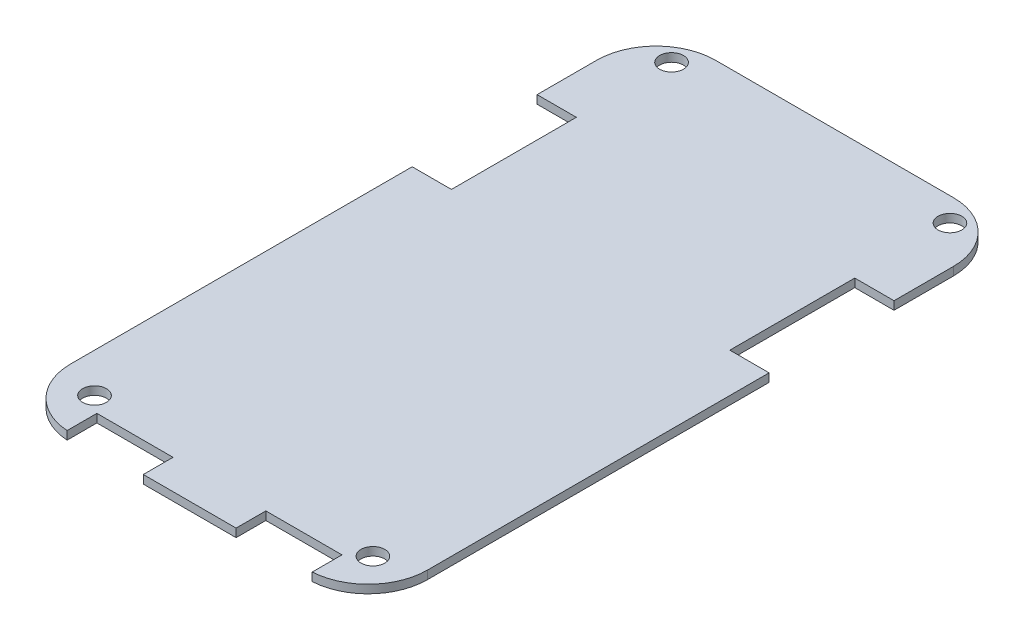
ISO-10303-21;
HEADER;
FILE_DESCRIPTION(('STEP AP214'),'2;1');
FILE_NAME('part.step','',(''),(''),'','','');
FILE_SCHEMA(('AUTOMOTIVE_DESIGN { 1 0 10303 214 1 1 1 1 }'));
ENDSEC;
DATA;
#1=APPLICATION_CONTEXT('core data for automotive mechanical design processes');
#2=APPLICATION_PROTOCOL_DEFINITION('international standard','automotive_design',2000,#1);
#3=PRODUCT_CONTEXT('',#1,'mechanical');
#4=PRODUCT('Part','Part','',(#3));
#5=PRODUCT_RELATED_PRODUCT_CATEGORY('part','',(#4));
#6=PRODUCT_DEFINITION_FORMATION('','',#4);
#7=PRODUCT_DEFINITION_CONTEXT('part definition',#1,'design');
#8=PRODUCT_DEFINITION('design','',#6,#7);
#9=PRODUCT_DEFINITION_SHAPE('','',#8);
#10=(LENGTH_UNIT() NAMED_UNIT(*) SI_UNIT(.MILLI.,.METRE.));
#11=(NAMED_UNIT(*) PLANE_ANGLE_UNIT() SI_UNIT($,.RADIAN.));
#12=(NAMED_UNIT(*) SI_UNIT($,.STERADIAN.) SOLID_ANGLE_UNIT());
#13=UNCERTAINTY_MEASURE_WITH_UNIT(LENGTH_MEASURE(1.E-05),#10,'distance_accuracy_value','');
#14=(GEOMETRIC_REPRESENTATION_CONTEXT(3) GLOBAL_UNCERTAINTY_ASSIGNED_CONTEXT((#13)) GLOBAL_UNIT_ASSIGNED_CONTEXT((#10,
#11,#12)) REPRESENTATION_CONTEXT('',''));
#15=CARTESIAN_POINT('',(0.,0.,0.));
#16=DIRECTION('',(0.,0.,1.));
#17=DIRECTION('',(1.,0.,0.));
#18=AXIS2_PLACEMENT_3D('',#15,#16,#17);
#19=CARTESIAN_POINT('',(-15.,0.7,27.1));
#20=DIRECTION('',(0.,0.,-1.));
#21=DIRECTION('',(-1.,0.,0.));
#22=AXIS2_PLACEMENT_3D('',#19,#20,#21);
#23=PLANE('',#22);
#24=DIRECTION('',(0.,1.,0.));
#25=VECTOR('',#24,1.);
#26=CARTESIAN_POINT('',(3.9,0.,27.1));
#27=LINE('',#26,#25);
#28=CARTESIAN_POINT('',(3.9,0.,27.1));
#29=VERTEX_POINT('',#28);
#30=CARTESIAN_POINT('',(3.9,0.7,27.1));
#31=VERTEX_POINT('',#30);
#32=EDGE_CURVE('E353',#29,#31,#27,.T.);
#33=ORIENTED_EDGE('',*,*,#32,.T.);
#34=DIRECTION('',(1.,0.,0.));
#35=VECTOR('',#34,1.);
#36=CARTESIAN_POINT('',(-15.,0.7,27.1));
#37=LINE('',#36,#35);
#38=CARTESIAN_POINT('',(-3.9,0.7,27.1));
#39=VERTEX_POINT('',#38);
#40=EDGE_CURVE('E255',#39,#31,#37,.T.);
#41=ORIENTED_EDGE('',*,*,#40,.F.);
#42=DIRECTION('',(0.,1.,0.));
#43=VECTOR('',#42,1.);
#44=CARTESIAN_POINT('',(-3.9,0.,27.1));
#45=LINE('',#44,#43);
#46=CARTESIAN_POINT('',(-3.9,0.,27.1));
#47=VERTEX_POINT('',#46);
#48=EDGE_CURVE('E301',#47,#39,#45,.T.);
#49=ORIENTED_EDGE('',*,*,#48,.F.);
#50=DIRECTION('',(1.,0.,0.));
#51=VECTOR('',#50,1.);
#52=CARTESIAN_POINT('',(-15.,0.,27.1));
#53=LINE('',#52,#51);
#54=EDGE_CURVE('E215',#47,#29,#53,.T.);
#55=ORIENTED_EDGE('',*,*,#54,.T.);
#56=EDGE_LOOP('',(#33,#41,#49,#55));
#57=FACE_BOUND('',#56,.T.);
#58=ADVANCED_FACE('F36',(#57),#23,.F.);
#59=CARTESIAN_POINT('',(15.,0.7,-27.1));
#60=DIRECTION('',(-1.,0.,0.));
#61=DIRECTION('',(0.,0.,1.));
#62=AXIS2_PLACEMENT_3D('',#59,#60,#61);
#63=PLANE('',#62);
#64=DIRECTION('',(0.,0.,-1.));
#65=VECTOR('',#64,1.);
#66=CARTESIAN_POINT('',(15.,0.7,-27.1));
#67=LINE('',#66,#65);
#68=CARTESIAN_POINT('',(15.,0.7,22.1090081146129));
#69=VERTEX_POINT('',#68);
#70=CARTESIAN_POINT('',(15.,0.7,-6.6));
#71=VERTEX_POINT('',#70);
#72=EDGE_CURVE('E254',#69,#71,#67,.T.);
#73=ORIENTED_EDGE('',*,*,#72,.F.);
#74=DIRECTION('',(0.,1.,0.));
#75=VECTOR('',#74,1.);
#76=CARTESIAN_POINT('',(15.,0.7,22.1090081146129));
#77=LINE('',#76,#75);
#78=CARTESIAN_POINT('',(15.,0.,22.1090081146129));
#79=VERTEX_POINT('',#78);
#80=EDGE_CURVE('E242',#69,#79,#77,.F.);
#81=ORIENTED_EDGE('',*,*,#80,.T.);
#82=DIRECTION('',(0.,0.,-1.));
#83=VECTOR('',#82,1.);
#84=CARTESIAN_POINT('',(15.,0.,-27.1));
#85=LINE('',#84,#83);
#86=CARTESIAN_POINT('',(15.,0.,-6.6));
#87=VERTEX_POINT('',#86);
#88=EDGE_CURVE('E214',#79,#87,#85,.T.);
#89=ORIENTED_EDGE('',*,*,#88,.T.);
#90=DIRECTION('',(0.,1.,0.));
#91=VECTOR('',#90,1.);
#92=CARTESIAN_POINT('',(15.,0.,-6.6));
#93=LINE('',#92,#91);
#94=EDGE_CURVE('E307',#87,#71,#93,.T.);
#95=ORIENTED_EDGE('',*,*,#94,.T.);
#96=EDGE_LOOP('',(#73,#81,#89,#95));
#97=FACE_BOUND('',#96,.T.);
#98=ADVANCED_FACE('F436',(#97),#63,.F.);
#99=CARTESIAN_POINT('',(15.,0.,-17.1));
#100=VERTEX_POINT('',#99);
#101=CARTESIAN_POINT('',(15.,0.,-22.1));
#102=VERTEX_POINT('',#101);
#103=EDGE_CURVE('E204',#100,#102,#85,.T.);
#104=ORIENTED_EDGE('',*,*,#103,.T.);
#105=DIRECTION('',(0.,-1.,0.));
#106=VECTOR('',#105,1.);
#107=CARTESIAN_POINT('',(15.,0.7,-22.1));
#108=LINE('',#107,#106);
#109=CARTESIAN_POINT('',(15.,0.7,-22.1));
#110=VERTEX_POINT('',#109);
#111=EDGE_CURVE('E44',#102,#110,#108,.F.);
#112=ORIENTED_EDGE('',*,*,#111,.T.);
#113=CARTESIAN_POINT('',(15.,0.7,-17.1));
#114=VERTEX_POINT('',#113);
#115=EDGE_CURVE('E207',#114,#110,#67,.T.);
#116=ORIENTED_EDGE('',*,*,#115,.F.);
#117=DIRECTION('',(0.,1.,0.));
#118=VECTOR('',#117,1.);
#119=CARTESIAN_POINT('',(15.,0.,-17.1));
#120=LINE('',#119,#118);
#121=EDGE_CURVE('E190',#100,#114,#120,.T.);
#122=ORIENTED_EDGE('',*,*,#121,.F.);
#123=EDGE_LOOP('',(#104,#112,#116,#122));
#124=FACE_BOUND('',#123,.T.);
#125=ADVANCED_FACE('F203',(#124),#63,.F.);
#126=CARTESIAN_POINT('',(0.,0.7,0.));
#127=DIRECTION('',(0.,1.,0.));
#128=DIRECTION('',(0.,0.,1.));
#129=AXIS2_PLACEMENT_3D('',#126,#127,#128);
#130=PLANE('',#129);
#131=CARTESIAN_POINT('',(11.7,0.7,-25.1));
#132=DIRECTION('',(0.,-1.,0.));
#133=DIRECTION('',(0.,0.,1.));
#134=AXIS2_PLACEMENT_3D('',#131,#132,#133);
#135=CIRCLE('',#134,1.);
#136=CARTESIAN_POINT('',(11.7,0.7,-24.1));
#137=VERTEX_POINT('',#136);
#138=EDGE_CURVE('E405',#137,#137,#135,.T.);
#139=ORIENTED_EDGE('',*,*,#138,.T.);
#140=EDGE_LOOP('',(#139));
#141=FACE_BOUND('',#140,.T.);
#142=CARTESIAN_POINT('',(11.7,0.7,23.4));
#143=DIRECTION('',(0.,-1.,0.));
#144=DIRECTION('',(0.,0.,1.));
#145=AXIS2_PLACEMENT_3D('',#142,#143,#144);
#146=CIRCLE('',#145,1.);
#147=CARTESIAN_POINT('',(11.7,0.7,24.4));
#148=VERTEX_POINT('',#147);
#149=EDGE_CURVE('E399',#148,#148,#146,.T.);
#150=ORIENTED_EDGE('',*,*,#149,.T.);
#151=EDGE_LOOP('',(#150));
#152=FACE_BOUND('',#151,.T.);
#153=CARTESIAN_POINT('',(-11.7,0.7,-25.1));
#154=DIRECTION('',(0.,1.,0.));
#155=DIRECTION('',(0.,0.,1.));
#156=AXIS2_PLACEMENT_3D('',#153,#154,#155);
#157=CIRCLE('',#156,1.);
#158=CARTESIAN_POINT('',(-11.7,0.7,-24.1));
#159=VERTEX_POINT('',#158);
#160=EDGE_CURVE('E394',#159,#159,#157,.T.);
#161=ORIENTED_EDGE('',*,*,#160,.F.);
#162=EDGE_LOOP('',(#161));
#163=FACE_BOUND('',#162,.T.);
#164=CARTESIAN_POINT('',(-11.7,0.7,23.4));
#165=DIRECTION('',(0.,1.,0.));
#166=DIRECTION('',(0.,0.,1.));
#167=AXIS2_PLACEMENT_3D('',#164,#165,#166);
#168=CIRCLE('',#167,1.);
#169=CARTESIAN_POINT('',(-11.7,0.7,24.4));
#170=VERTEX_POINT('',#169);
#171=EDGE_CURVE('E390',#170,#170,#168,.T.);
#172=ORIENTED_EDGE('',*,*,#171,.F.);
#173=EDGE_LOOP('',(#172));
#174=FACE_BOUND('',#173,.T.);
#175=DIRECTION('',(0.,0.,1.));
#176=VECTOR('',#175,1.);
#177=CARTESIAN_POINT('',(-15.,0.7,-27.1));
#178=LINE('',#177,#176);
#179=CARTESIAN_POINT('',(-15.,0.7,-6.6));
#180=VERTEX_POINT('',#179);
#181=CARTESIAN_POINT('',(-15.,0.7,22.1090081146129));
#182=VERTEX_POINT('',#181);
#183=EDGE_CURVE('E224',#180,#182,#178,.T.);
#184=ORIENTED_EDGE('',*,*,#183,.T.);
#185=CARTESIAN_POINT('',(-9.99999999999999,0.7,22.1090081146129));
#186=DIRECTION('',(0.,1.,0.));
#187=DIRECTION('',(0.,0.,1.));
#188=AXIS2_PLACEMENT_3D('',#185,#186,#187);
#189=CIRCLE('',#188,5.);
#190=CARTESIAN_POINT('',(-10.3,0.7,27.1));
#191=VERTEX_POINT('',#190);
#192=EDGE_CURVE('E240',#182,#191,#189,.T.);
#193=ORIENTED_EDGE('',*,*,#192,.T.);
#194=DIRECTION('',(0.,0.,1.));
#195=VECTOR('',#194,1.);
#196=CARTESIAN_POINT('',(-10.3,0.7,24.6));
#197=LINE('',#196,#195);
#198=CARTESIAN_POINT('',(-10.3,0.7,24.6));
#199=VERTEX_POINT('',#198);
#200=EDGE_CURVE('E314',#199,#191,#197,.T.);
#201=ORIENTED_EDGE('',*,*,#200,.F.);
#202=DIRECTION('',(-1.,0.,0.));
#203=VECTOR('',#202,1.);
#204=CARTESIAN_POINT('',(-10.3,0.7,24.6));
#205=LINE('',#204,#203);
#206=CARTESIAN_POINT('',(-3.9,0.7,24.6));
#207=VERTEX_POINT('',#206);
#208=EDGE_CURVE('E308',#207,#199,#205,.T.);
#209=ORIENTED_EDGE('',*,*,#208,.F.);
#210=DIRECTION('',(0.,0.,-1.));
#211=VECTOR('',#210,1.);
#212=CARTESIAN_POINT('',(-3.9,0.7,24.6));
#213=LINE('',#212,#211);
#214=EDGE_CURVE('E311',#39,#207,#213,.T.);
#215=ORIENTED_EDGE('',*,*,#214,.F.);
#216=ORIENTED_EDGE('',*,*,#40,.T.);
#217=DIRECTION('',(0.,0.,-1.));
#218=VECTOR('',#217,1.);
#219=CARTESIAN_POINT('',(3.9,0.7,24.6));
#220=LINE('',#219,#218);
#221=CARTESIAN_POINT('',(3.9,0.7,24.6));
#222=VERTEX_POINT('',#221);
#223=EDGE_CURVE('E358',#31,#222,#220,.T.);
#224=ORIENTED_EDGE('',*,*,#223,.T.);
#225=DIRECTION('',(1.,0.,0.));
#226=VECTOR('',#225,1.);
#227=CARTESIAN_POINT('',(10.3,0.7,24.6));
#228=LINE('',#227,#226);
#229=CARTESIAN_POINT('',(10.3,0.7,24.6));
#230=VERTEX_POINT('',#229);
#231=EDGE_CURVE('E362',#222,#230,#228,.T.);
#232=ORIENTED_EDGE('',*,*,#231,.T.);
#233=DIRECTION('',(0.,0.,1.));
#234=VECTOR('',#233,1.);
#235=CARTESIAN_POINT('',(10.3,0.7,24.6));
#236=LINE('',#235,#234);
#237=CARTESIAN_POINT('',(10.3,0.7,27.1));
#238=VERTEX_POINT('',#237);
#239=EDGE_CURVE('E365',#230,#238,#236,.T.);
#240=ORIENTED_EDGE('',*,*,#239,.T.);
#241=CARTESIAN_POINT('',(10.,0.7,22.1090081146129));
#242=DIRECTION('',(0.,1.,0.));
#243=DIRECTION('',(0.,0.,1.));
#244=AXIS2_PLACEMENT_3D('',#241,#242,#243);
#245=CIRCLE('',#244,5.);
#246=EDGE_CURVE('E238',#238,#69,#245,.T.);
#247=ORIENTED_EDGE('',*,*,#246,.T.);
#248=ORIENTED_EDGE('',*,*,#72,.T.);
#249=DIRECTION('',(-1.,0.,0.));
#250=VECTOR('',#249,1.);
#251=CARTESIAN_POINT('',(15.,0.7,-6.6));
#252=LINE('',#251,#250);
#253=CARTESIAN_POINT('',(11.7,0.7,-6.6));
#254=VERTEX_POINT('',#253);
#255=EDGE_CURVE('E198',#71,#254,#252,.T.);
#256=ORIENTED_EDGE('',*,*,#255,.T.);
#257=DIRECTION('',(0.,0.,-1.));
#258=VECTOR('',#257,1.);
#259=CARTESIAN_POINT('',(11.7,0.7,-17.1));
#260=LINE('',#259,#258);
#261=CARTESIAN_POINT('',(11.7,0.7,-17.1));
#262=VERTEX_POINT('',#261);
#263=EDGE_CURVE('E382',#254,#262,#260,.T.);
#264=ORIENTED_EDGE('',*,*,#263,.T.);
#265=DIRECTION('',(1.,0.,0.));
#266=VECTOR('',#265,1.);
#267=CARTESIAN_POINT('',(15.,0.7,-17.1));
#268=LINE('',#267,#266);
#269=EDGE_CURVE('E253',#262,#114,#268,.T.);
#270=ORIENTED_EDGE('',*,*,#269,.T.);
#271=ORIENTED_EDGE('',*,*,#115,.T.);
#272=CARTESIAN_POINT('',(9.99999999999999,0.7,-22.1));
#273=DIRECTION('',(0.,1.,0.));
#274=DIRECTION('',(0.,0.,1.));
#275=AXIS2_PLACEMENT_3D('',#272,#273,#274);
#276=CIRCLE('',#275,5.);
#277=CARTESIAN_POINT('',(9.99999999999999,0.7,-27.1));
#278=VERTEX_POINT('',#277);
#279=EDGE_CURVE('E236',#110,#278,#276,.T.);
#280=ORIENTED_EDGE('',*,*,#279,.T.);
#281=DIRECTION('',(-1.,0.,0.));
#282=VECTOR('',#281,1.);
#283=CARTESIAN_POINT('',(-15.,0.7,-27.1));
#284=LINE('',#283,#282);
#285=CARTESIAN_POINT('',(-10.,0.7,-27.1));
#286=VERTEX_POINT('',#285);
#287=EDGE_CURVE('E227',#278,#286,#284,.T.);
#288=ORIENTED_EDGE('',*,*,#287,.T.);
#289=CARTESIAN_POINT('',(-10.,0.7,-22.1));
#290=DIRECTION('',(0.,1.,0.));
#291=DIRECTION('',(0.,0.,1.));
#292=AXIS2_PLACEMENT_3D('',#289,#290,#291);
#293=CIRCLE('',#292,5.);
#294=CARTESIAN_POINT('',(-15.,0.7,-22.1));
#295=VERTEX_POINT('',#294);
#296=EDGE_CURVE('E51',#286,#295,#293,.T.);
#297=ORIENTED_EDGE('',*,*,#296,.T.);
#298=CARTESIAN_POINT('',(-15.,0.7,-17.1));
#299=VERTEX_POINT('',#298);
#300=EDGE_CURVE('E268',#295,#299,#178,.T.);
#301=ORIENTED_EDGE('',*,*,#300,.T.);
#302=DIRECTION('',(-1.,0.,0.));
#303=VECTOR('',#302,1.);
#304=CARTESIAN_POINT('',(-15.,0.7,-17.1));
#305=LINE('',#304,#303);
#306=CARTESIAN_POINT('',(-11.7,0.7,-17.1));
#307=VERTEX_POINT('',#306);
#308=EDGE_CURVE('E290',#307,#299,#305,.T.);
#309=ORIENTED_EDGE('',*,*,#308,.F.);
#310=DIRECTION('',(0.,0.,-1.));
#311=VECTOR('',#310,1.);
#312=CARTESIAN_POINT('',(-11.7,0.7,-17.1));
#313=LINE('',#312,#311);
#314=CARTESIAN_POINT('',(-11.7,0.7,-6.6));
#315=VERTEX_POINT('',#314);
#316=EDGE_CURVE('E336',#315,#307,#313,.T.);
#317=ORIENTED_EDGE('',*,*,#316,.F.);
#318=DIRECTION('',(1.,0.,0.));
#319=VECTOR('',#318,1.);
#320=CARTESIAN_POINT('',(-15.,0.7,-6.6));
#321=LINE('',#320,#319);
#322=EDGE_CURVE('E317',#180,#315,#321,.T.);
#323=ORIENTED_EDGE('',*,*,#322,.F.);
#324=EDGE_LOOP('',(#184,#193,#201,#209,#215,#216,#224,#232,#240,#247,#248,#256,#264,#270,#271,
#280,#288,#297,#301,#309,#317,#323));
#325=FACE_BOUND('',#324,.T.);
#326=ADVANCED_FACE('F251',(#141,#152,#163,#174,#325),#130,.T.);
#327=CARTESIAN_POINT('',(0.,0.,0.));
#328=DIRECTION('',(0.,1.,0.));
#329=DIRECTION('',(0.,0.,1.));
#330=AXIS2_PLACEMENT_3D('',#327,#328,#329);
#331=PLANE('',#330);
#332=CARTESIAN_POINT('',(11.7,0.,-25.1));
#333=DIRECTION('',(0.,-1.,0.));
#334=DIRECTION('',(0.,0.,1.));
#335=AXIS2_PLACEMENT_3D('',#332,#333,#334);
#336=CIRCLE('',#335,1.);
#337=CARTESIAN_POINT('',(11.7,0.,-24.1));
#338=VERTEX_POINT('',#337);
#339=EDGE_CURVE('E391',#338,#338,#336,.T.);
#340=ORIENTED_EDGE('',*,*,#339,.F.);
#341=EDGE_LOOP('',(#340));
#342=FACE_BOUND('',#341,.T.);
#343=CARTESIAN_POINT('',(11.7,0.,23.4));
#344=DIRECTION('',(0.,-1.,0.));
#345=DIRECTION('',(0.,0.,1.));
#346=AXIS2_PLACEMENT_3D('',#343,#344,#345);
#347=CIRCLE('',#346,1.);
#348=CARTESIAN_POINT('',(11.7,0.,24.4));
#349=VERTEX_POINT('',#348);
#350=EDGE_CURVE('E402',#349,#349,#347,.T.);
#351=ORIENTED_EDGE('',*,*,#350,.F.);
#352=EDGE_LOOP('',(#351));
#353=FACE_BOUND('',#352,.T.);
#354=CARTESIAN_POINT('',(-11.7,0.,-25.1));
#355=DIRECTION('',(0.,1.,0.));
#356=DIRECTION('',(0.,0.,1.));
#357=AXIS2_PLACEMENT_3D('',#354,#355,#356);
#358=CIRCLE('',#357,1.);
#359=CARTESIAN_POINT('',(-11.7,0.,-24.1));
#360=VERTEX_POINT('',#359);
#361=EDGE_CURVE('E368',#360,#360,#358,.T.);
#362=ORIENTED_EDGE('',*,*,#361,.T.);
#363=EDGE_LOOP('',(#362));
#364=FACE_BOUND('',#363,.T.);
#365=CARTESIAN_POINT('',(-11.7,0.,23.4));
#366=DIRECTION('',(0.,1.,0.));
#367=DIRECTION('',(0.,0.,1.));
#368=AXIS2_PLACEMENT_3D('',#365,#366,#367);
#369=CIRCLE('',#368,1.);
#370=CARTESIAN_POINT('',(-11.7,0.,24.4));
#371=VERTEX_POINT('',#370);
#372=EDGE_CURVE('E387',#371,#371,#369,.T.);
#373=ORIENTED_EDGE('',*,*,#372,.T.);
#374=EDGE_LOOP('',(#373));
#375=FACE_BOUND('',#374,.T.);
#376=DIRECTION('',(0.,0.,1.));
#377=VECTOR('',#376,1.);
#378=CARTESIAN_POINT('',(-10.3,0.,24.6));
#379=LINE('',#378,#377);
#380=CARTESIAN_POINT('',(-10.3,0.,24.6));
#381=VERTEX_POINT('',#380);
#382=CARTESIAN_POINT('',(-10.3,0.,27.1));
#383=VERTEX_POINT('',#382);
#384=EDGE_CURVE('E276',#381,#383,#379,.T.);
#385=ORIENTED_EDGE('',*,*,#384,.T.);
#386=CARTESIAN_POINT('',(-9.99999999999999,0.,22.1090081146129));
#387=DIRECTION('',(0.,1.,0.));
#388=DIRECTION('',(0.,0.,1.));
#389=AXIS2_PLACEMENT_3D('',#386,#387,#388);
#390=CIRCLE('',#389,5.);
#391=CARTESIAN_POINT('',(-15.,0.,22.1090081146129));
#392=VERTEX_POINT('',#391);
#393=EDGE_CURVE('E231',#383,#392,#390,.F.);
#394=ORIENTED_EDGE('',*,*,#393,.T.);
#395=DIRECTION('',(0.,0.,1.));
#396=VECTOR('',#395,1.);
#397=CARTESIAN_POINT('',(-15.,0.,-27.1));
#398=LINE('',#397,#396);
#399=CARTESIAN_POINT('',(-15.,0.,-6.6));
#400=VERTEX_POINT('',#399);
#401=EDGE_CURVE('E279',#400,#392,#398,.T.);
#402=ORIENTED_EDGE('',*,*,#401,.F.);
#403=DIRECTION('',(1.,0.,0.));
#404=VECTOR('',#403,1.);
#405=CARTESIAN_POINT('',(-15.,0.,-6.6));
#406=LINE('',#405,#404);
#407=CARTESIAN_POINT('',(-11.7,0.,-6.6));
#408=VERTEX_POINT('',#407);
#409=EDGE_CURVE('E345',#400,#408,#406,.T.);
#410=ORIENTED_EDGE('',*,*,#409,.T.);
#411=DIRECTION('',(0.,0.,-1.));
#412=VECTOR('',#411,1.);
#413=CARTESIAN_POINT('',(-11.7,0.,-17.1));
#414=LINE('',#413,#412);
#415=CARTESIAN_POINT('',(-11.7,0.,-17.1));
#416=VERTEX_POINT('',#415);
#417=EDGE_CURVE('E342',#408,#416,#414,.T.);
#418=ORIENTED_EDGE('',*,*,#417,.T.);
#419=DIRECTION('',(-1.,0.,0.));
#420=VECTOR('',#419,1.);
#421=CARTESIAN_POINT('',(-15.,0.,-17.1));
#422=LINE('',#421,#420);
#423=CARTESIAN_POINT('',(-15.,0.,-17.1));
#424=VERTEX_POINT('',#423);
#425=EDGE_CURVE('E296',#416,#424,#422,.T.);
#426=ORIENTED_EDGE('',*,*,#425,.T.);
#427=CARTESIAN_POINT('',(-15.,0.,-22.1));
#428=VERTEX_POINT('',#427);
#429=EDGE_CURVE('E219',#428,#424,#398,.T.);
#430=ORIENTED_EDGE('',*,*,#429,.F.);
#431=CARTESIAN_POINT('',(-10.,0.,-22.1));
#432=DIRECTION('',(0.,1.,0.));
#433=DIRECTION('',(0.,0.,1.));
#434=AXIS2_PLACEMENT_3D('',#431,#432,#433);
#435=CIRCLE('',#434,5.);
#436=CARTESIAN_POINT('',(-10.,0.,-27.1));
#437=VERTEX_POINT('',#436);
#438=EDGE_CURVE('E225',#428,#437,#435,.F.);
#439=ORIENTED_EDGE('',*,*,#438,.T.);
#440=DIRECTION('',(-1.,0.,0.));
#441=VECTOR('',#440,1.);
#442=CARTESIAN_POINT('',(-15.,0.,-27.1));
#443=LINE('',#442,#441);
#444=CARTESIAN_POINT('',(9.99999999999999,0.,-27.1));
#445=VERTEX_POINT('',#444);
#446=EDGE_CURVE('E217',#445,#437,#443,.T.);
#447=ORIENTED_EDGE('',*,*,#446,.F.);
#448=CARTESIAN_POINT('',(9.99999999999999,0.,-22.1));
#449=DIRECTION('',(0.,1.,0.));
#450=DIRECTION('',(0.,0.,1.));
#451=AXIS2_PLACEMENT_3D('',#448,#449,#450);
#452=CIRCLE('',#451,5.);
#453=EDGE_CURVE('E213',#445,#102,#452,.F.);
#454=ORIENTED_EDGE('',*,*,#453,.T.);
#455=ORIENTED_EDGE('',*,*,#103,.F.);
#456=DIRECTION('',(1.,0.,0.));
#457=VECTOR('',#456,1.);
#458=CARTESIAN_POINT('',(15.,0.,-17.1));
#459=LINE('',#458,#457);
#460=CARTESIAN_POINT('',(11.7,0.,-17.1));
#461=VERTEX_POINT('',#460);
#462=EDGE_CURVE('E186',#461,#100,#459,.T.);
#463=ORIENTED_EDGE('',*,*,#462,.F.);
#464=DIRECTION('',(0.,0.,-1.));
#465=VECTOR('',#464,1.);
#466=CARTESIAN_POINT('',(11.7,0.,-17.1));
#467=LINE('',#466,#465);
#468=CARTESIAN_POINT('',(11.7,0.,-6.6));
#469=VERTEX_POINT('',#468);
#470=EDGE_CURVE('E197',#469,#461,#467,.T.);
#471=ORIENTED_EDGE('',*,*,#470,.F.);
#472=DIRECTION('',(-1.,0.,0.));
#473=VECTOR('',#472,1.);
#474=CARTESIAN_POINT('',(15.,0.,-6.6));
#475=LINE('',#474,#473);
#476=EDGE_CURVE('E208',#87,#469,#475,.T.);
#477=ORIENTED_EDGE('',*,*,#476,.F.);
#478=ORIENTED_EDGE('',*,*,#88,.F.);
#479=CARTESIAN_POINT('',(10.,0.,22.1090081146129));
#480=DIRECTION('',(0.,1.,0.));
#481=DIRECTION('',(0.,0.,1.));
#482=AXIS2_PLACEMENT_3D('',#479,#480,#481);
#483=CIRCLE('',#482,5.);
#484=CARTESIAN_POINT('',(10.3,0.,27.1));
#485=VERTEX_POINT('',#484);
#486=EDGE_CURVE('E229',#79,#485,#483,.F.);
#487=ORIENTED_EDGE('',*,*,#486,.T.);
#488=DIRECTION('',(0.,0.,1.));
#489=VECTOR('',#488,1.);
#490=CARTESIAN_POINT('',(10.3,0.,24.6));
#491=LINE('',#490,#489);
#492=CARTESIAN_POINT('',(10.3,0.,24.6));
#493=VERTEX_POINT('',#492);
#494=EDGE_CURVE('E361',#493,#485,#491,.T.);
#495=ORIENTED_EDGE('',*,*,#494,.F.);
#496=DIRECTION('',(1.,0.,0.));
#497=VECTOR('',#496,1.);
#498=CARTESIAN_POINT('',(10.3,0.,24.6));
#499=LINE('',#498,#497);
#500=CARTESIAN_POINT('',(3.9,0.,24.6));
#501=VERTEX_POINT('',#500);
#502=EDGE_CURVE('E371',#501,#493,#499,.T.);
#503=ORIENTED_EDGE('',*,*,#502,.F.);
#504=DIRECTION('',(0.,0.,-1.));
#505=VECTOR('',#504,1.);
#506=CARTESIAN_POINT('',(3.9,0.,24.6));
#507=LINE('',#506,#505);
#508=EDGE_CURVE('E351',#29,#501,#507,.T.);
#509=ORIENTED_EDGE('',*,*,#508,.F.);
#510=ORIENTED_EDGE('',*,*,#54,.F.);
#511=DIRECTION('',(0.,0.,-1.));
#512=VECTOR('',#511,1.);
#513=CARTESIAN_POINT('',(-3.9,0.,24.6));
#514=LINE('',#513,#512);
#515=CARTESIAN_POINT('',(-3.9,0.,24.6));
#516=VERTEX_POINT('',#515);
#517=EDGE_CURVE('E319',#47,#516,#514,.T.);
#518=ORIENTED_EDGE('',*,*,#517,.T.);
#519=DIRECTION('',(-1.,0.,0.));
#520=VECTOR('',#519,1.);
#521=CARTESIAN_POINT('',(-10.3,0.,24.6));
#522=LINE('',#521,#520);
#523=EDGE_CURVE('E300',#516,#381,#522,.T.);
#524=ORIENTED_EDGE('',*,*,#523,.T.);
#525=EDGE_LOOP('',(#385,#394,#402,#410,#418,#426,#430,#439,#447,#454,#455,#463,#471,#477,#478,
#487,#495,#503,#509,#510,#518,#524));
#526=FACE_BOUND('',#525,.T.);
#527=ADVANCED_FACE('F211',(#342,#353,#364,#375,#526),#331,.F.);
#528=CARTESIAN_POINT('',(-15.,0.7,-27.1));
#529=DIRECTION('',(1.,0.,0.));
#530=DIRECTION('',(0.,0.,-1.));
#531=AXIS2_PLACEMENT_3D('',#528,#529,#530);
#532=PLANE('',#531);
#533=ORIENTED_EDGE('',*,*,#300,.F.);
#534=DIRECTION('',(0.,-1.,0.));
#535=VECTOR('',#534,1.);
#536=CARTESIAN_POINT('',(-15.,0.7,-22.1));
#537=LINE('',#536,#535);
#538=EDGE_CURVE('E11',#295,#428,#537,.T.);
#539=ORIENTED_EDGE('',*,*,#538,.T.);
#540=ORIENTED_EDGE('',*,*,#429,.T.);
#541=DIRECTION('',(0.,1.,0.));
#542=VECTOR('',#541,1.);
#543=CARTESIAN_POINT('',(-15.,0.,-17.1));
#544=LINE('',#543,#542);
#545=EDGE_CURVE('E269',#424,#299,#544,.T.);
#546=ORIENTED_EDGE('',*,*,#545,.T.);
#547=EDGE_LOOP('',(#533,#539,#540,#546));
#548=FACE_BOUND('',#547,.T.);
#549=ADVANCED_FACE('F265',(#548),#532,.F.);
#550=ORIENTED_EDGE('',*,*,#401,.T.);
#551=DIRECTION('',(0.,1.,0.));
#552=VECTOR('',#551,1.);
#553=CARTESIAN_POINT('',(-15.,0.7,22.1090081146129));
#554=LINE('',#553,#552);
#555=EDGE_CURVE('E233',#392,#182,#554,.T.);
#556=ORIENTED_EDGE('',*,*,#555,.T.);
#557=ORIENTED_EDGE('',*,*,#183,.F.);
#558=DIRECTION('',(0.,1.,0.));
#559=VECTOR('',#558,1.);
#560=CARTESIAN_POINT('',(-15.,0.,-6.6));
#561=LINE('',#560,#559);
#562=EDGE_CURVE('E294',#400,#180,#561,.T.);
#563=ORIENTED_EDGE('',*,*,#562,.F.);
#564=EDGE_LOOP('',(#550,#556,#557,#563));
#565=FACE_BOUND('',#564,.T.);
#566=ADVANCED_FACE('F331',(#565),#532,.F.);
#567=CARTESIAN_POINT('',(-15.,0.7,-27.1));
#568=DIRECTION('',(0.,0.,1.));
#569=DIRECTION('',(1.,0.,0.));
#570=AXIS2_PLACEMENT_3D('',#567,#568,#569);
#571=PLANE('',#570);
#572=ORIENTED_EDGE('',*,*,#287,.F.);
#573=DIRECTION('',(0.,-1.,0.));
#574=VECTOR('',#573,1.);
#575=CARTESIAN_POINT('',(9.99999999999999,0.7,-27.1));
#576=LINE('',#575,#574);
#577=EDGE_CURVE('E246',#278,#445,#576,.T.);
#578=ORIENTED_EDGE('',*,*,#577,.T.);
#579=ORIENTED_EDGE('',*,*,#446,.T.);
#580=DIRECTION('',(0.,-1.,0.));
#581=VECTOR('',#580,1.);
#582=CARTESIAN_POINT('',(-10.,0.7,-27.1));
#583=LINE('',#582,#581);
#584=EDGE_CURVE('E59',#437,#286,#583,.F.);
#585=ORIENTED_EDGE('',*,*,#584,.T.);
#586=EDGE_LOOP('',(#572,#578,#579,#585));
#587=FACE_BOUND('',#586,.T.);
#588=ADVANCED_FACE('F259',(#587),#571,.F.);
#589=CARTESIAN_POINT('',(-10.3,0.,24.6));
#590=DIRECTION('',(-1.,0.,0.));
#591=DIRECTION('',(0.,0.,1.));
#592=AXIS2_PLACEMENT_3D('',#589,#590,#591);
#593=PLANE('',#592);
#594=ORIENTED_EDGE('',*,*,#200,.T.);
#595=DIRECTION('',(0.,1.,0.));
#596=VECTOR('',#595,1.);
#597=CARTESIAN_POINT('',(-10.3,0.,27.1));
#598=LINE('',#597,#596);
#599=EDGE_CURVE('E297',#383,#191,#598,.T.);
#600=ORIENTED_EDGE('',*,*,#599,.F.);
#601=ORIENTED_EDGE('',*,*,#384,.F.);
#602=DIRECTION('',(0.,1.,0.));
#603=VECTOR('',#602,1.);
#604=CARTESIAN_POINT('',(-10.3,0.,24.6));
#605=LINE('',#604,#603);
#606=EDGE_CURVE('E305',#381,#199,#605,.T.);
#607=ORIENTED_EDGE('',*,*,#606,.T.);
#608=EDGE_LOOP('',(#594,#600,#601,#607));
#609=FACE_BOUND('',#608,.T.);
#610=ADVANCED_FACE('F325',(#609),#593,.F.);
#611=CARTESIAN_POINT('',(-10.3,0.,24.6));
#612=DIRECTION('',(0.,0.,-1.));
#613=DIRECTION('',(-1.,0.,0.));
#614=AXIS2_PLACEMENT_3D('',#611,#612,#613);
#615=PLANE('',#614);
#616=ORIENTED_EDGE('',*,*,#208,.T.);
#617=ORIENTED_EDGE('',*,*,#606,.F.);
#618=ORIENTED_EDGE('',*,*,#523,.F.);
#619=DIRECTION('',(0.,1.,0.));
#620=VECTOR('',#619,1.);
#621=CARTESIAN_POINT('',(-3.9,0.,24.6));
#622=LINE('',#621,#620);
#623=EDGE_CURVE('E303',#516,#207,#622,.T.);
#624=ORIENTED_EDGE('',*,*,#623,.T.);
#625=EDGE_LOOP('',(#616,#617,#618,#624));
#626=FACE_BOUND('',#625,.T.);
#627=ADVANCED_FACE('F664',(#626),#615,.F.);
#628=CARTESIAN_POINT('',(-3.9,0.,24.6));
#629=DIRECTION('',(1.,0.,0.));
#630=DIRECTION('',(0.,0.,-1.));
#631=AXIS2_PLACEMENT_3D('',#628,#629,#630);
#632=PLANE('',#631);
#633=ORIENTED_EDGE('',*,*,#214,.T.);
#634=ORIENTED_EDGE('',*,*,#623,.F.);
#635=ORIENTED_EDGE('',*,*,#517,.F.);
#636=ORIENTED_EDGE('',*,*,#48,.T.);
#637=EDGE_LOOP('',(#633,#634,#635,#636));
#638=FACE_BOUND('',#637,.T.);
#639=ADVANCED_FACE('F653',(#638),#632,.F.);
#640=CARTESIAN_POINT('',(-15.,0.,-17.1));
#641=DIRECTION('',(0.,0.,-1.));
#642=DIRECTION('',(-1.,0.,0.));
#643=AXIS2_PLACEMENT_3D('',#640,#641,#642);
#644=PLANE('',#643);
#645=ORIENTED_EDGE('',*,*,#308,.T.);
#646=ORIENTED_EDGE('',*,*,#545,.F.);
#647=ORIENTED_EDGE('',*,*,#425,.F.);
#648=DIRECTION('',(0.,1.,0.));
#649=VECTOR('',#648,1.);
#650=CARTESIAN_POINT('',(-11.7,0.,-17.1));
#651=LINE('',#650,#649);
#652=EDGE_CURVE('E285',#416,#307,#651,.T.);
#653=ORIENTED_EDGE('',*,*,#652,.T.);
#654=EDGE_LOOP('',(#645,#646,#647,#653));
#655=FACE_BOUND('',#654,.T.);
#656=ADVANCED_FACE('F642',(#655),#644,.F.);
#657=CARTESIAN_POINT('',(-11.7,0.,-17.1));
#658=DIRECTION('',(1.,0.,0.));
#659=DIRECTION('',(0.,0.,-1.));
#660=AXIS2_PLACEMENT_3D('',#657,#658,#659);
#661=PLANE('',#660);
#662=ORIENTED_EDGE('',*,*,#316,.T.);
#663=ORIENTED_EDGE('',*,*,#652,.F.);
#664=ORIENTED_EDGE('',*,*,#417,.F.);
#665=DIRECTION('',(0.,1.,0.));
#666=VECTOR('',#665,1.);
#667=CARTESIAN_POINT('',(-11.7,0.,-6.6));
#668=LINE('',#667,#666);
#669=EDGE_CURVE('E287',#408,#315,#668,.T.);
#670=ORIENTED_EDGE('',*,*,#669,.T.);
#671=EDGE_LOOP('',(#662,#663,#664,#670));
#672=FACE_BOUND('',#671,.T.);
#673=ADVANCED_FACE('F632',(#672),#661,.F.);
#674=CARTESIAN_POINT('',(-15.,0.,-6.6));
#675=DIRECTION('',(0.,0.,1.));
#676=DIRECTION('',(1.,0.,0.));
#677=AXIS2_PLACEMENT_3D('',#674,#675,#676);
#678=PLANE('',#677);
#679=ORIENTED_EDGE('',*,*,#322,.T.);
#680=ORIENTED_EDGE('',*,*,#669,.F.);
#681=ORIENTED_EDGE('',*,*,#409,.F.);
#682=ORIENTED_EDGE('',*,*,#562,.T.);
#683=EDGE_LOOP('',(#679,#680,#681,#682));
#684=FACE_BOUND('',#683,.T.);
#685=ADVANCED_FACE('F592',(#684),#678,.F.);
#686=CARTESIAN_POINT('',(10.3,0.,24.6));
#687=DIRECTION('',(-1.,0.,0.));
#688=DIRECTION('',(0.,0.,1.));
#689=AXIS2_PLACEMENT_3D('',#686,#687,#688);
#690=PLANE('',#689);
#691=ORIENTED_EDGE('',*,*,#239,.F.);
#692=DIRECTION('',(0.,1.,0.));
#693=VECTOR('',#692,1.);
#694=CARTESIAN_POINT('',(10.3,0.,24.6));
#695=LINE('',#694,#693);
#696=EDGE_CURVE('E348',#493,#230,#695,.T.);
#697=ORIENTED_EDGE('',*,*,#696,.F.);
#698=ORIENTED_EDGE('',*,*,#494,.T.);
#699=DIRECTION('',(0.,1.,0.));
#700=VECTOR('',#699,1.);
#701=CARTESIAN_POINT('',(10.3,0.,27.1));
#702=LINE('',#701,#700);
#703=EDGE_CURVE('E356',#485,#238,#702,.T.);
#704=ORIENTED_EDGE('',*,*,#703,.T.);
#705=EDGE_LOOP('',(#691,#697,#698,#704));
#706=FACE_BOUND('',#705,.T.);
#707=ADVANCED_FACE('F582',(#706),#690,.T.);
#708=CARTESIAN_POINT('',(3.9,0.,24.6));
#709=DIRECTION('',(1.,0.,0.));
#710=DIRECTION('',(0.,0.,-1.));
#711=AXIS2_PLACEMENT_3D('',#708,#709,#710);
#712=PLANE('',#711);
#713=ORIENTED_EDGE('',*,*,#223,.F.);
#714=ORIENTED_EDGE('',*,*,#32,.F.);
#715=ORIENTED_EDGE('',*,*,#508,.T.);
#716=DIRECTION('',(0.,1.,0.));
#717=VECTOR('',#716,1.);
#718=CARTESIAN_POINT('',(3.9,0.,24.6));
#719=LINE('',#718,#717);
#720=EDGE_CURVE('E350',#501,#222,#719,.T.);
#721=ORIENTED_EDGE('',*,*,#720,.T.);
#722=EDGE_LOOP('',(#713,#714,#715,#721));
#723=FACE_BOUND('',#722,.T.);
#724=ADVANCED_FACE('F571',(#723),#712,.T.);
#725=CARTESIAN_POINT('',(10.3,0.,24.6));
#726=DIRECTION('',(0.,0.,1.));
#727=DIRECTION('',(1.,0.,0.));
#728=AXIS2_PLACEMENT_3D('',#725,#726,#727);
#729=PLANE('',#728);
#730=ORIENTED_EDGE('',*,*,#231,.F.);
#731=ORIENTED_EDGE('',*,*,#720,.F.);
#732=ORIENTED_EDGE('',*,*,#502,.T.);
#733=ORIENTED_EDGE('',*,*,#696,.T.);
#734=EDGE_LOOP('',(#730,#731,#732,#733));
#735=FACE_BOUND('',#734,.T.);
#736=ADVANCED_FACE('F560',(#735),#729,.T.);
#737=CARTESIAN_POINT('',(15.,0.,-6.6));
#738=DIRECTION('',(0.,0.,-1.));
#739=DIRECTION('',(-1.,0.,0.));
#740=AXIS2_PLACEMENT_3D('',#737,#738,#739);
#741=PLANE('',#740);
#742=ORIENTED_EDGE('',*,*,#255,.F.);
#743=ORIENTED_EDGE('',*,*,#94,.F.);
#744=ORIENTED_EDGE('',*,*,#476,.T.);
#745=DIRECTION('',(0.,1.,0.));
#746=VECTOR('',#745,1.);
#747=CARTESIAN_POINT('',(11.7,0.,-6.6));
#748=LINE('',#747,#746);
#749=EDGE_CURVE('E376',#469,#254,#748,.T.);
#750=ORIENTED_EDGE('',*,*,#749,.T.);
#751=EDGE_LOOP('',(#742,#743,#744,#750));
#752=FACE_BOUND('',#751,.T.);
#753=ADVANCED_FACE('F549',(#752),#741,.T.);
#754=CARTESIAN_POINT('',(11.7,0.,-17.1));
#755=DIRECTION('',(1.,0.,0.));
#756=DIRECTION('',(0.,0.,-1.));
#757=AXIS2_PLACEMENT_3D('',#754,#755,#756);
#758=PLANE('',#757);
#759=ORIENTED_EDGE('',*,*,#263,.F.);
#760=ORIENTED_EDGE('',*,*,#749,.F.);
#761=ORIENTED_EDGE('',*,*,#470,.T.);
#762=DIRECTION('',(0.,1.,0.));
#763=VECTOR('',#762,1.);
#764=CARTESIAN_POINT('',(11.7,0.,-17.1));
#765=LINE('',#764,#763);
#766=EDGE_CURVE('E192',#461,#262,#765,.T.);
#767=ORIENTED_EDGE('',*,*,#766,.T.);
#768=EDGE_LOOP('',(#759,#760,#761,#767));
#769=FACE_BOUND('',#768,.T.);
#770=ADVANCED_FACE('F538',(#769),#758,.T.);
#771=CARTESIAN_POINT('',(15.,0.,-17.1));
#772=DIRECTION('',(0.,0.,1.));
#773=DIRECTION('',(1.,0.,0.));
#774=AXIS2_PLACEMENT_3D('',#771,#772,#773);
#775=PLANE('',#774);
#776=ORIENTED_EDGE('',*,*,#269,.F.);
#777=ORIENTED_EDGE('',*,*,#766,.F.);
#778=ORIENTED_EDGE('',*,*,#462,.T.);
#779=ORIENTED_EDGE('',*,*,#121,.T.);
#780=EDGE_LOOP('',(#776,#777,#778,#779));
#781=FACE_BOUND('',#780,.T.);
#782=ADVANCED_FACE('F189',(#781),#775,.T.);
#783=CARTESIAN_POINT('',(-9.99999999999999,0.7,22.1090081146129));
#784=DIRECTION('',(0.,1.,0.));
#785=DIRECTION('',(0.,0.,1.));
#786=AXIS2_PLACEMENT_3D('',#783,#784,#785);
#787=CYLINDRICAL_SURFACE('',#786,5.);
#788=ORIENTED_EDGE('',*,*,#192,.F.);
#789=ORIENTED_EDGE('',*,*,#555,.F.);
#790=ORIENTED_EDGE('',*,*,#393,.F.);
#791=ORIENTED_EDGE('',*,*,#599,.T.);
#792=EDGE_LOOP('',(#788,#789,#790,#791));
#793=FACE_BOUND('',#792,.T.);
#794=ADVANCED_FACE('F329',(#793),#787,.T.);
#795=CARTESIAN_POINT('',(10.,0.7,22.1090081146129));
#796=DIRECTION('',(0.,1.,0.));
#797=DIRECTION('',(0.,0.,1.));
#798=AXIS2_PLACEMENT_3D('',#795,#796,#797);
#799=CYLINDRICAL_SURFACE('',#798,5.);
#800=ORIENTED_EDGE('',*,*,#246,.F.);
#801=ORIENTED_EDGE('',*,*,#703,.F.);
#802=ORIENTED_EDGE('',*,*,#486,.F.);
#803=ORIENTED_EDGE('',*,*,#80,.F.);
#804=EDGE_LOOP('',(#800,#801,#802,#803));
#805=FACE_BOUND('',#804,.T.);
#806=ADVANCED_FACE('F453',(#805),#799,.T.);
#807=CARTESIAN_POINT('',(9.99999999999999,0.7,-22.1));
#808=DIRECTION('',(0.,-1.,0.));
#809=DIRECTION('',(0.,0.,-1.));
#810=AXIS2_PLACEMENT_3D('',#807,#808,#809);
#811=CYLINDRICAL_SURFACE('',#810,5.);
#812=ORIENTED_EDGE('',*,*,#279,.F.);
#813=ORIENTED_EDGE('',*,*,#111,.F.);
#814=ORIENTED_EDGE('',*,*,#453,.F.);
#815=ORIENTED_EDGE('',*,*,#577,.F.);
#816=EDGE_LOOP('',(#812,#813,#814,#815));
#817=FACE_BOUND('',#816,.T.);
#818=ADVANCED_FACE('F258',(#817),#811,.T.);
#819=CARTESIAN_POINT('',(-10.,0.7,-22.1));
#820=DIRECTION('',(0.,-1.,0.));
#821=DIRECTION('',(0.,0.,-1.));
#822=AXIS2_PLACEMENT_3D('',#819,#820,#821);
#823=CYLINDRICAL_SURFACE('',#822,5.);
#824=ORIENTED_EDGE('',*,*,#296,.F.);
#825=ORIENTED_EDGE('',*,*,#584,.F.);
#826=ORIENTED_EDGE('',*,*,#438,.F.);
#827=ORIENTED_EDGE('',*,*,#538,.F.);
#828=EDGE_LOOP('',(#824,#825,#826,#827));
#829=FACE_BOUND('',#828,.T.);
#830=ADVANCED_FACE('F38',(#829),#823,.T.);
#831=CARTESIAN_POINT('',(-11.7,0.,23.4));
#832=DIRECTION('',(0.,1.,0.));
#833=DIRECTION('',(0.,0.,1.));
#834=AXIS2_PLACEMENT_3D('',#831,#832,#833);
#835=CYLINDRICAL_SURFACE('',#834,1.);
#836=ORIENTED_EDGE('',*,*,#372,.F.);
#837=EDGE_LOOP('',(#836));
#838=FACE_BOUND('',#837,.T.);
#839=ORIENTED_EDGE('',*,*,#171,.T.);
#840=EDGE_LOOP('',(#839));
#841=FACE_BOUND('',#840,.T.);
#842=ADVANCED_FACE('F423',(#838,#841),#835,.F.);
#843=CARTESIAN_POINT('',(-11.7,0.,-25.1));
#844=DIRECTION('',(0.,1.,0.));
#845=DIRECTION('',(0.,0.,1.));
#846=AXIS2_PLACEMENT_3D('',#843,#844,#845);
#847=CYLINDRICAL_SURFACE('',#846,1.);
#848=ORIENTED_EDGE('',*,*,#361,.F.);
#849=EDGE_LOOP('',(#848));
#850=FACE_BOUND('',#849,.T.);
#851=ORIENTED_EDGE('',*,*,#160,.T.);
#852=EDGE_LOOP('',(#851));
#853=FACE_BOUND('',#852,.T.);
#854=ADVANCED_FACE('F426',(#850,#853),#847,.F.);
#855=CARTESIAN_POINT('',(11.7,0.,23.4));
#856=DIRECTION('',(0.,1.,0.));
#857=DIRECTION('',(0.,0.,1.));
#858=AXIS2_PLACEMENT_3D('',#855,#856,#857);
#859=CYLINDRICAL_SURFACE('',#858,1.);
#860=ORIENTED_EDGE('',*,*,#350,.T.);
#861=EDGE_LOOP('',(#860));
#862=FACE_BOUND('',#861,.T.);
#863=ORIENTED_EDGE('',*,*,#149,.F.);
#864=EDGE_LOOP('',(#863));
#865=FACE_BOUND('',#864,.T.);
#866=ADVANCED_FACE('F472',(#862,#865),#859,.F.);
#867=CARTESIAN_POINT('',(11.7,0.,-25.1));
#868=DIRECTION('',(0.,1.,0.));
#869=DIRECTION('',(0.,0.,1.));
#870=AXIS2_PLACEMENT_3D('',#867,#868,#869);
#871=CYLINDRICAL_SURFACE('',#870,1.);
#872=ORIENTED_EDGE('',*,*,#339,.T.);
#873=EDGE_LOOP('',(#872));
#874=FACE_BOUND('',#873,.T.);
#875=ORIENTED_EDGE('',*,*,#138,.F.);
#876=EDGE_LOOP('',(#875));
#877=FACE_BOUND('',#876,.T.);
#878=ADVANCED_FACE('F411',(#874,#877),#871,.F.);
#879=CLOSED_SHELL('',(#58,#98,#125,#326,#527,#549,#566,#588,#610,#627,#639,#656,#673,#685,#707,
#724,#736,#753,#770,#782,#794,#806,#818,#830,#842,#854,#866,#878));
#880=MANIFOLD_SOLID_BREP('B2',#879);
#881=ADVANCED_BREP_SHAPE_REPRESENTATION('',(#18,#880),#14);
#882=SHAPE_DEFINITION_REPRESENTATION(#9,#881);
ENDSEC;
END-ISO-10303-21;
